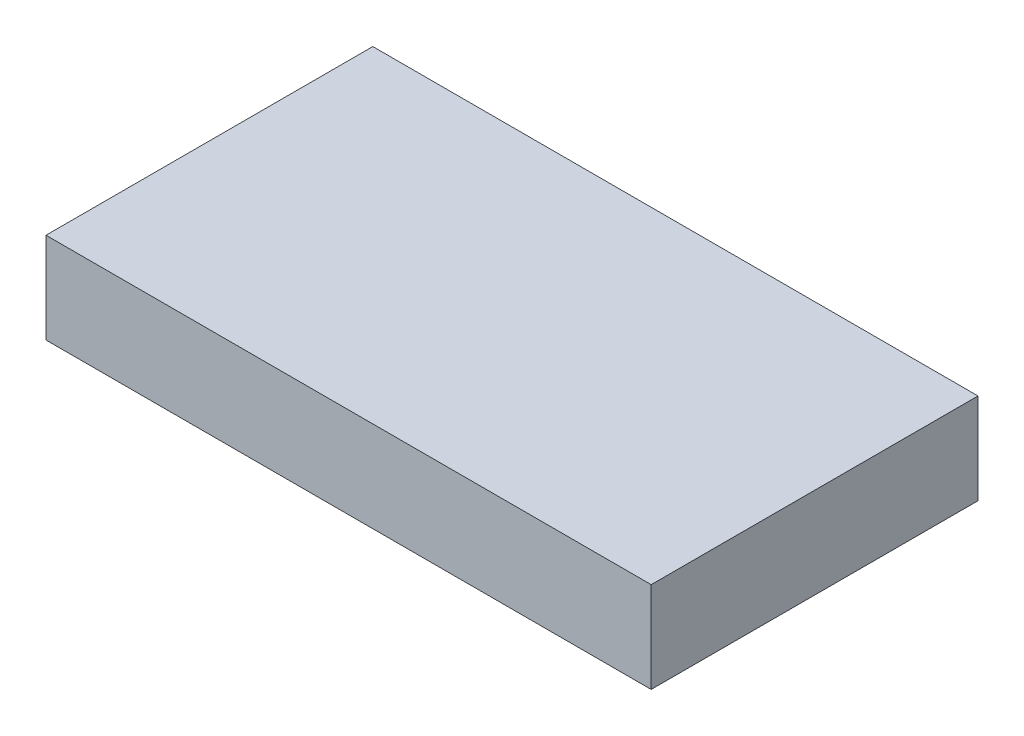
ISO-10303-21;
HEADER;
FILE_DESCRIPTION(('STEP AP214'),'2;1');
FILE_NAME('part.step','',(''),(''),'','','');
FILE_SCHEMA(('AUTOMOTIVE_DESIGN { 1 0 10303 214 1 1 1 1 }'));
ENDSEC;
DATA;
#1=APPLICATION_CONTEXT('core data for automotive mechanical design processes');
#2=APPLICATION_PROTOCOL_DEFINITION('international standard','automotive_design',2000,#1);
#3=PRODUCT_CONTEXT('',#1,'mechanical');
#4=PRODUCT('Part','Part','',(#3));
#5=PRODUCT_RELATED_PRODUCT_CATEGORY('part','',(#4));
#6=PRODUCT_DEFINITION_FORMATION('','',#4);
#7=PRODUCT_DEFINITION_CONTEXT('part definition',#1,'design');
#8=PRODUCT_DEFINITION('design','',#6,#7);
#9=PRODUCT_DEFINITION_SHAPE('','',#8);
#10=(LENGTH_UNIT() NAMED_UNIT(*) SI_UNIT(.MILLI.,.METRE.));
#11=(NAMED_UNIT(*) PLANE_ANGLE_UNIT() SI_UNIT($,.RADIAN.));
#12=(NAMED_UNIT(*) SI_UNIT($,.STERADIAN.) SOLID_ANGLE_UNIT());
#13=UNCERTAINTY_MEASURE_WITH_UNIT(LENGTH_MEASURE(1.E-05),#10,'distance_accuracy_value','');
#14=(GEOMETRIC_REPRESENTATION_CONTEXT(3) GLOBAL_UNCERTAINTY_ASSIGNED_CONTEXT((#13)) GLOBAL_UNIT_ASSIGNED_CONTEXT((#10,
#11,#12)) REPRESENTATION_CONTEXT('',''));
#15=CARTESIAN_POINT('',(0.,0.,0.));
#16=DIRECTION('',(0.,0.,1.));
#17=DIRECTION('',(1.,0.,0.));
#18=AXIS2_PLACEMENT_3D('',#15,#16,#17);
#19=CARTESIAN_POINT('',(-90.475276695282,19.05,-49.1836005711112));
#20=DIRECTION('',(1.,0.,0.));
#21=DIRECTION('',(0.,0.,-1.));
#22=AXIS2_PLACEMENT_3D('',#19,#20,#21);
#23=PLANE('',#22);
#24=DIRECTION('',(0.,0.,1.));
#25=VECTOR('',#24,1.);
#26=CARTESIAN_POINT('',(-90.475276695282,0.,-49.1836005711112));
#27=LINE('',#26,#25);
#28=CARTESIAN_POINT('',(-90.475276695282,0.,-49.1836005711112));
#29=VERTEX_POINT('',#28);
#30=CARTESIAN_POINT('',(-90.4752766952819,0.,19.3963994288888));
#31=VERTEX_POINT('',#30);
#32=EDGE_CURVE('E97',#29,#31,#27,.T.);
#33=ORIENTED_EDGE('',*,*,#32,.T.);
#34=DIRECTION('',(0.,-1.,0.));
#35=VECTOR('',#34,1.);
#36=CARTESIAN_POINT('',(-90.4752766952819,19.05,19.3963994288888));
#37=LINE('',#36,#35);
#38=CARTESIAN_POINT('',(-90.4752766952819,19.05,19.3963994288888));
#39=VERTEX_POINT('',#38);
#40=EDGE_CURVE('E11',#39,#31,#37,.T.);
#41=ORIENTED_EDGE('',*,*,#40,.F.);
#42=DIRECTION('',(0.,0.,1.));
#43=VECTOR('',#42,1.);
#44=CARTESIAN_POINT('',(-90.475276695282,19.05,-49.1836005711112));
#45=LINE('',#44,#43);
#46=CARTESIAN_POINT('',(-90.475276695282,19.05,-49.1836005711112));
#47=VERTEX_POINT('',#46);
#48=EDGE_CURVE('E85',#47,#39,#45,.T.);
#49=ORIENTED_EDGE('',*,*,#48,.F.);
#50=DIRECTION('',(0.,-1.,0.));
#51=VECTOR('',#50,1.);
#52=CARTESIAN_POINT('',(-90.475276695282,19.05,-49.1836005711112));
#53=LINE('',#52,#51);
#54=EDGE_CURVE('E93',#47,#29,#53,.T.);
#55=ORIENTED_EDGE('',*,*,#54,.T.);
#56=EDGE_LOOP('',(#33,#41,#49,#55));
#57=FACE_BOUND('',#56,.T.);
#58=ADVANCED_FACE('F34',(#57),#23,.F.);
#59=CARTESIAN_POINT('',(-90.4752766952819,19.05,19.3963994288888));
#60=DIRECTION('',(0.,0.,-1.));
#61=DIRECTION('',(-1.,0.,0.));
#62=AXIS2_PLACEMENT_3D('',#59,#60,#61);
#63=PLANE('',#62);
#64=DIRECTION('',(1.,0.,0.));
#65=VECTOR('',#64,1.);
#66=CARTESIAN_POINT('',(-90.4752766952819,0.,19.3963994288888));
#67=LINE('',#66,#65);
#68=CARTESIAN_POINT('',(36.5247233047181,0.,19.3963994288888));
#69=VERTEX_POINT('',#68);
#70=EDGE_CURVE('E89',#31,#69,#67,.T.);
#71=ORIENTED_EDGE('',*,*,#70,.T.);
#72=DIRECTION('',(0.,-1.,0.));
#73=VECTOR('',#72,1.);
#74=CARTESIAN_POINT('',(36.5247233047181,19.05,19.3963994288888));
#75=LINE('',#74,#73);
#76=CARTESIAN_POINT('',(36.5247233047181,19.05,19.3963994288888));
#77=VERTEX_POINT('',#76);
#78=EDGE_CURVE('E42',#77,#69,#75,.T.);
#79=ORIENTED_EDGE('',*,*,#78,.F.);
#80=DIRECTION('',(1.,0.,0.));
#81=VECTOR('',#80,1.);
#82=CARTESIAN_POINT('',(-90.4752766952819,19.05,19.3963994288888));
#83=LINE('',#82,#81);
#84=EDGE_CURVE('E80',#39,#77,#83,.T.);
#85=ORIENTED_EDGE('',*,*,#84,.F.);
#86=ORIENTED_EDGE('',*,*,#40,.T.);
#87=EDGE_LOOP('',(#71,#79,#85,#86));
#88=FACE_BOUND('',#87,.T.);
#89=ADVANCED_FACE('F88',(#88),#63,.F.);
#90=CARTESIAN_POINT('',(36.524723304718,19.05,-49.1836005711112));
#91=DIRECTION('',(-1.,0.,0.));
#92=DIRECTION('',(0.,0.,1.));
#93=AXIS2_PLACEMENT_3D('',#90,#91,#92);
#94=PLANE('',#93);
#95=DIRECTION('',(0.,0.,-1.));
#96=VECTOR('',#95,1.);
#97=CARTESIAN_POINT('',(36.524723304718,0.,-49.1836005711112));
#98=LINE('',#97,#96);
#99=CARTESIAN_POINT('',(36.524723304718,0.,-49.1836005711112));
#100=VERTEX_POINT('',#99);
#101=EDGE_CURVE('E67',#69,#100,#98,.T.);
#102=ORIENTED_EDGE('',*,*,#101,.T.);
#103=DIRECTION('',(0.,-1.,0.));
#104=VECTOR('',#103,1.);
#105=CARTESIAN_POINT('',(36.524723304718,19.05,-49.1836005711112));
#106=LINE('',#105,#104);
#107=CARTESIAN_POINT('',(36.524723304718,19.05,-49.1836005711112));
#108=VERTEX_POINT('',#107);
#109=EDGE_CURVE('E90',#108,#100,#106,.T.);
#110=ORIENTED_EDGE('',*,*,#109,.F.);
#111=DIRECTION('',(0.,0.,-1.));
#112=VECTOR('',#111,1.);
#113=CARTESIAN_POINT('',(36.524723304718,19.05,-49.1836005711112));
#114=LINE('',#113,#112);
#115=EDGE_CURVE('E83',#77,#108,#114,.T.);
#116=ORIENTED_EDGE('',*,*,#115,.F.);
#117=ORIENTED_EDGE('',*,*,#78,.T.);
#118=EDGE_LOOP('',(#102,#110,#116,#117));
#119=FACE_BOUND('',#118,.T.);
#120=ADVANCED_FACE('F91',(#119),#94,.F.);
#121=CARTESIAN_POINT('',(-90.475276695282,19.05,-49.1836005711112));
#122=DIRECTION('',(0.,0.,1.));
#123=DIRECTION('',(1.,0.,0.));
#124=AXIS2_PLACEMENT_3D('',#121,#122,#123);
#125=PLANE('',#124);
#126=DIRECTION('',(-1.,0.,0.));
#127=VECTOR('',#126,1.);
#128=CARTESIAN_POINT('',(-90.475276695282,0.,-49.1836005711112));
#129=LINE('',#128,#127);
#130=EDGE_CURVE('E73',#100,#29,#129,.T.);
#131=ORIENTED_EDGE('',*,*,#130,.T.);
#132=ORIENTED_EDGE('',*,*,#54,.F.);
#133=DIRECTION('',(-1.,0.,0.));
#134=VECTOR('',#133,1.);
#135=CARTESIAN_POINT('',(-90.475276695282,19.05,-49.1836005711112));
#136=LINE('',#135,#134);
#137=EDGE_CURVE('E50',#108,#47,#136,.T.);
#138=ORIENTED_EDGE('',*,*,#137,.F.);
#139=ORIENTED_EDGE('',*,*,#109,.T.);
#140=EDGE_LOOP('',(#131,#132,#138,#139));
#141=FACE_BOUND('',#140,.T.);
#142=ADVANCED_FACE('F104',(#141),#125,.F.);
#143=CARTESIAN_POINT('',(-90.4752766952819,19.05,19.3963994288888));
#144=DIRECTION('',(0.,1.,0.));
#145=DIRECTION('',(0.,0.,1.));
#146=AXIS2_PLACEMENT_3D('',#143,#144,#145);
#147=PLANE('',#146);
#148=ORIENTED_EDGE('',*,*,#48,.T.);
#149=ORIENTED_EDGE('',*,*,#84,.T.);
#150=ORIENTED_EDGE('',*,*,#115,.T.);
#151=ORIENTED_EDGE('',*,*,#137,.T.);
#152=EDGE_LOOP('',(#148,#149,#150,#151));
#153=FACE_BOUND('',#152,.T.);
#154=ADVANCED_FACE('F81',(#153),#147,.T.);
#155=CARTESIAN_POINT('',(-90.4752766952819,0.,19.3963994288888));
#156=DIRECTION('',(0.,1.,0.));
#157=DIRECTION('',(0.,0.,1.));
#158=AXIS2_PLACEMENT_3D('',#155,#156,#157);
#159=PLANE('',#158);
#160=ORIENTED_EDGE('',*,*,#32,.F.);
#161=ORIENTED_EDGE('',*,*,#130,.F.);
#162=ORIENTED_EDGE('',*,*,#101,.F.);
#163=ORIENTED_EDGE('',*,*,#70,.F.);
#164=EDGE_LOOP('',(#160,#161,#162,#163));
#165=FACE_BOUND('',#164,.T.);
#166=ADVANCED_FACE('F107',(#165),#159,.F.);
#167=CLOSED_SHELL('',(#58,#89,#120,#142,#154,#166));
#168=MANIFOLD_SOLID_BREP('B2',#167);
#169=ADVANCED_BREP_SHAPE_REPRESENTATION('',(#18,#168),#14);
#170=SHAPE_DEFINITION_REPRESENTATION(#9,#169);
ENDSEC;
END-ISO-10303-21;
